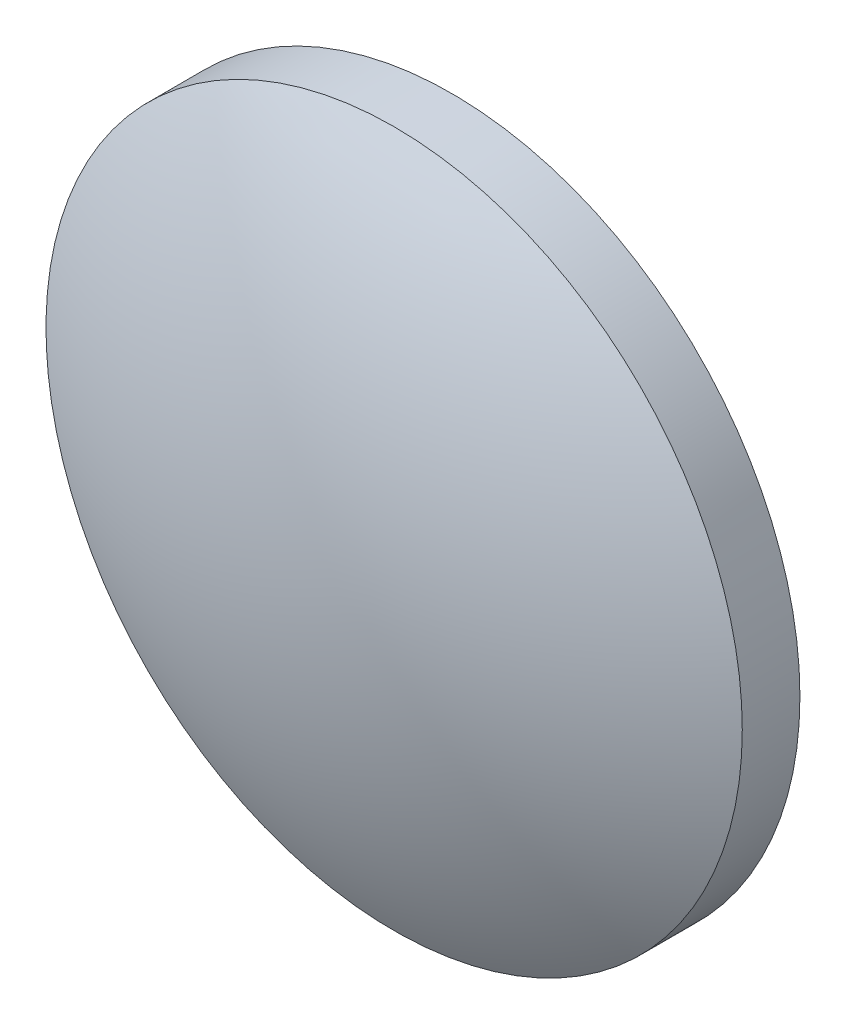
ISO-10303-21;
HEADER;
FILE_DESCRIPTION(('STEP AP214'),'2;1');
FILE_NAME('part.step','',(''),(''),'','','');
FILE_SCHEMA(('AUTOMOTIVE_DESIGN { 1 0 10303 214 1 1 1 1 }'));
ENDSEC;
DATA;
#1=APPLICATION_CONTEXT('core data for automotive mechanical design processes');
#2=APPLICATION_PROTOCOL_DEFINITION('international standard','automotive_design',2000,#1);
#3=PRODUCT_CONTEXT('',#1,'mechanical');
#4=PRODUCT('Part','Part','',(#3));
#5=PRODUCT_RELATED_PRODUCT_CATEGORY('part','',(#4));
#6=PRODUCT_DEFINITION_FORMATION('','',#4);
#7=PRODUCT_DEFINITION_CONTEXT('part definition',#1,'design');
#8=PRODUCT_DEFINITION('design','',#6,#7);
#9=PRODUCT_DEFINITION_SHAPE('','',#8);
#10=(LENGTH_UNIT() NAMED_UNIT(*) SI_UNIT(.MILLI.,.METRE.));
#11=(NAMED_UNIT(*) PLANE_ANGLE_UNIT() SI_UNIT($,.RADIAN.));
#12=(NAMED_UNIT(*) SI_UNIT($,.STERADIAN.) SOLID_ANGLE_UNIT());
#13=UNCERTAINTY_MEASURE_WITH_UNIT(LENGTH_MEASURE(1.E-05),#10,'distance_accuracy_value','');
#14=(GEOMETRIC_REPRESENTATION_CONTEXT(3) GLOBAL_UNCERTAINTY_ASSIGNED_CONTEXT((#13)) GLOBAL_UNIT_ASSIGNED_CONTEXT((#10,
#11,#12)) REPRESENTATION_CONTEXT('',''));
#15=CARTESIAN_POINT('',(0.,0.,0.));
#16=DIRECTION('',(0.,0.,1.));
#17=DIRECTION('',(1.,0.,0.));
#18=AXIS2_PLACEMENT_3D('',#15,#16,#17);
#19=CARTESIAN_POINT('',(0.,0.,-23.15));
#20=DIRECTION('',(0.,0.,1.));
#21=DIRECTION('',(0.,1.,0.));
#22=AXIS2_PLACEMENT_3D('',#19,#20,#21);
#23=SPHERICAL_SURFACE('',#22,25.8);
#24=CARTESIAN_POINT('',(0.,0.,-0.580330086596298));
#25=DIRECTION('',(0.,0.,1.));
#26=DIRECTION('',(1.,0.,0.));
#27=AXIS2_PLACEMENT_3D('',#24,#25,#26);
#28=CIRCLE('',#27,12.5);
#29=CARTESIAN_POINT('',(12.5,0.,-0.580330086596298));
#30=VERTEX_POINT('',#29);
#31=EDGE_CURVE('E10',#30,#30,#28,.T.);
#32=ORIENTED_EDGE('',*,*,#31,.T.);
#33=EDGE_LOOP('',(#32));
#34=FACE_BOUND('',#33,.T.);
#35=ADVANCED_FACE('F14',(#34),#23,.T.);
#36=CARTESIAN_POINT('',(0.,0.,4.30813204540037));
#37=DIRECTION('',(0.,0.,1.));
#38=DIRECTION('',(1.,0.,0.));
#39=AXIS2_PLACEMENT_3D('',#36,#37,#38);
#40=CYLINDRICAL_SURFACE('',#39,12.5);
#41=ORIENTED_EDGE('',*,*,#31,.F.);
#42=EDGE_LOOP('',(#41));
#43=FACE_BOUND('',#42,.T.);
#44=CARTESIAN_POINT('',(0.,0.,-2.65));
#45=DIRECTION('',(0.,0.,1.));
#46=DIRECTION('',(1.,0.,0.));
#47=AXIS2_PLACEMENT_3D('',#44,#45,#46);
#48=CIRCLE('',#47,12.5);
#49=CARTESIAN_POINT('',(12.5,0.,-2.65));
#50=VERTEX_POINT('',#49);
#51=EDGE_CURVE('E21',#50,#50,#48,.T.);
#52=ORIENTED_EDGE('',*,*,#51,.T.);
#53=EDGE_LOOP('',(#52));
#54=FACE_BOUND('',#53,.T.);
#55=ADVANCED_FACE('F31',(#43,#54),#40,.T.);
#56=CARTESIAN_POINT('',(0.,0.,-2.65));
#57=DIRECTION('',(0.,0.,1.));
#58=DIRECTION('',(1.,0.,0.));
#59=AXIS2_PLACEMENT_3D('',#56,#57,#58);
#60=PLANE('',#59);
#61=ORIENTED_EDGE('',*,*,#51,.F.);
#62=EDGE_LOOP('',(#61));
#63=FACE_BOUND('',#62,.T.);
#64=ADVANCED_FACE('F33',(#63),#60,.F.);
#65=CLOSED_SHELL('',(#35,#55,#64));
#66=MANIFOLD_SOLID_BREP('B1',#65);
#67=ADVANCED_BREP_SHAPE_REPRESENTATION('',(#18,#66),#14);
#68=SHAPE_DEFINITION_REPRESENTATION(#9,#67);
ENDSEC;
END-ISO-10303-21;
